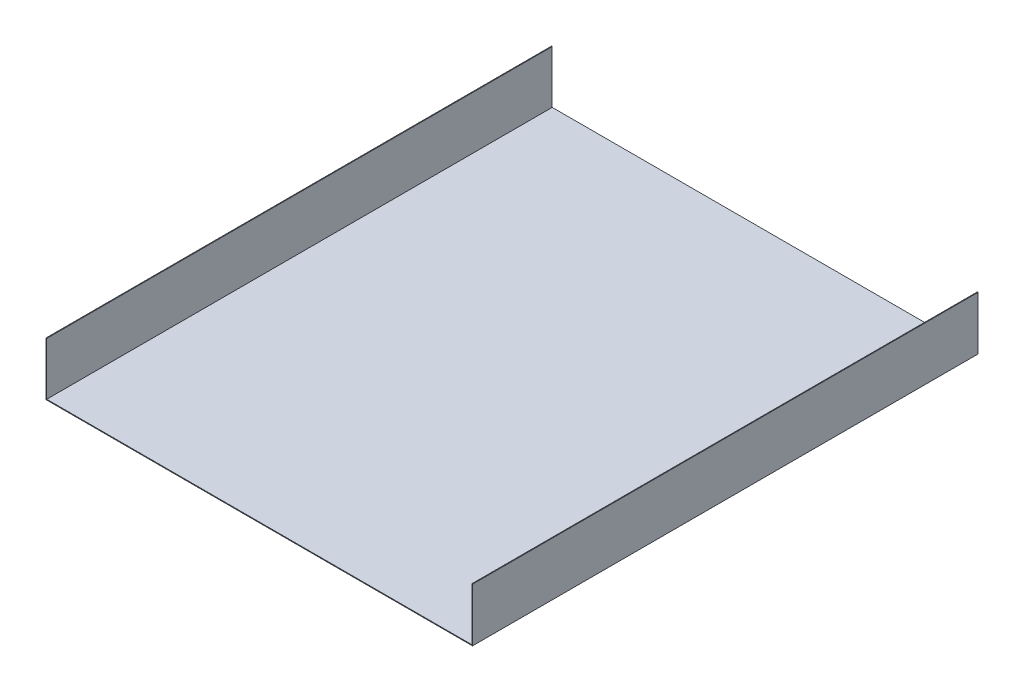
ISO-10303-21;
HEADER;
FILE_DESCRIPTION(('STEP AP214'),'2;1');
FILE_NAME('part.step','',(''),(''),'','','');
FILE_SCHEMA(('AUTOMOTIVE_DESIGN { 1 0 10303 214 1 1 1 1 }'));
ENDSEC;
DATA;
#1=APPLICATION_CONTEXT('core data for automotive mechanical design processes');
#2=APPLICATION_PROTOCOL_DEFINITION('international standard','automotive_design',2000,#1);
#3=PRODUCT_CONTEXT('',#1,'mechanical');
#4=PRODUCT('Part','Part','',(#3));
#5=PRODUCT_RELATED_PRODUCT_CATEGORY('part','',(#4));
#6=PRODUCT_DEFINITION_FORMATION('','',#4);
#7=PRODUCT_DEFINITION_CONTEXT('part definition',#1,'design');
#8=PRODUCT_DEFINITION('design','',#6,#7);
#9=PRODUCT_DEFINITION_SHAPE('','',#8);
#10=(LENGTH_UNIT() NAMED_UNIT(*) SI_UNIT(.MILLI.,.METRE.));
#11=(NAMED_UNIT(*) PLANE_ANGLE_UNIT() SI_UNIT($,.RADIAN.));
#12=(NAMED_UNIT(*) SI_UNIT($,.STERADIAN.) SOLID_ANGLE_UNIT());
#13=UNCERTAINTY_MEASURE_WITH_UNIT(LENGTH_MEASURE(1.E-05),#10,'distance_accuracy_value','');
#14=(GEOMETRIC_REPRESENTATION_CONTEXT(3) GLOBAL_UNCERTAINTY_ASSIGNED_CONTEXT((#13)) GLOBAL_UNIT_ASSIGNED_CONTEXT((#10,
#11,#12)) REPRESENTATION_CONTEXT('',''));
#15=CARTESIAN_POINT('',(0.,0.,0.));
#16=DIRECTION('',(0.,0.,1.));
#17=DIRECTION('',(1.,0.,0.));
#18=AXIS2_PLACEMENT_3D('',#15,#16,#17);
#19=CARTESIAN_POINT('',(14.7,82.,-700.));
#20=DIRECTION('',(0.,1.,0.));
#21=DIRECTION('',(0.,0.,1.));
#22=AXIS2_PLACEMENT_3D('',#19,#20,#21);
#23=PLANE('',#22);
#24=DIRECTION('',(-1.,0.,0.));
#25=VECTOR('',#24,1.);
#26=CARTESIAN_POINT('',(14.7,82.,0.));
#27=LINE('',#26,#25);
#28=CARTESIAN_POINT('',(14.7,82.,0.));
#29=VERTEX_POINT('',#28);
#30=CARTESIAN_POINT('',(13.7,82.,0.));
#31=VERTEX_POINT('',#30);
#32=EDGE_CURVE('E136',#29,#31,#27,.T.);
#33=ORIENTED_EDGE('',*,*,#32,.F.);
#34=DIRECTION('',(0.,0.,1.));
#35=VECTOR('',#34,1.);
#36=CARTESIAN_POINT('',(14.7,82.,-700.));
#37=LINE('',#36,#35);
#38=CARTESIAN_POINT('',(14.7,82.,-700.));
#39=VERTEX_POINT('',#38);
#40=EDGE_CURVE('E11',#39,#29,#37,.T.);
#41=ORIENTED_EDGE('',*,*,#40,.F.);
#42=DIRECTION('',(-1.,0.,0.));
#43=VECTOR('',#42,1.);
#44=CARTESIAN_POINT('',(14.7,82.,-700.));
#45=LINE('',#44,#43);
#46=CARTESIAN_POINT('',(13.7,82.,-700.));
#47=VERTEX_POINT('',#46);
#48=EDGE_CURVE('E156',#39,#47,#45,.T.);
#49=ORIENTED_EDGE('',*,*,#48,.T.);
#50=DIRECTION('',(0.,0.,1.));
#51=VECTOR('',#50,1.);
#52=CARTESIAN_POINT('',(13.7,82.,-700.));
#53=LINE('',#52,#51);
#54=EDGE_CURVE('E42',#47,#31,#53,.T.);
#55=ORIENTED_EDGE('',*,*,#54,.T.);
#56=EDGE_LOOP('',(#33,#41,#49,#55));
#57=FACE_BOUND('',#56,.T.);
#58=ADVANCED_FACE('F39',(#57),#23,.T.);
#59=CARTESIAN_POINT('',(14.7,9.,-700.));
#60=DIRECTION('',(1.,0.,0.));
#61=DIRECTION('',(0.,0.,-1.));
#62=AXIS2_PLACEMENT_3D('',#59,#60,#61);
#63=PLANE('',#62);
#64=DIRECTION('',(0.,1.,0.));
#65=VECTOR('',#64,1.);
#66=CARTESIAN_POINT('',(14.7,9.,0.));
#67=LINE('',#66,#65);
#68=CARTESIAN_POINT('',(14.7,9.,0.));
#69=VERTEX_POINT('',#68);
#70=EDGE_CURVE('E154',#69,#29,#67,.T.);
#71=ORIENTED_EDGE('',*,*,#70,.F.);
#72=DIRECTION('',(0.,0.,1.));
#73=VECTOR('',#72,1.);
#74=CARTESIAN_POINT('',(14.7,9.,-700.));
#75=LINE('',#74,#73);
#76=CARTESIAN_POINT('',(14.7,9.,-700.));
#77=VERTEX_POINT('',#76);
#78=EDGE_CURVE('E48',#77,#69,#75,.T.);
#79=ORIENTED_EDGE('',*,*,#78,.F.);
#80=DIRECTION('',(0.,1.,0.));
#81=VECTOR('',#80,1.);
#82=CARTESIAN_POINT('',(14.7,9.,-700.));
#83=LINE('',#82,#81);
#84=EDGE_CURVE('E126',#77,#39,#83,.T.);
#85=ORIENTED_EDGE('',*,*,#84,.T.);
#86=ORIENTED_EDGE('',*,*,#40,.T.);
#87=EDGE_LOOP('',(#71,#79,#85,#86));
#88=FACE_BOUND('',#87,.T.);
#89=ADVANCED_FACE('F168',(#88),#63,.T.);
#90=CARTESIAN_POINT('',(603.3,9.,-700.));
#91=DIRECTION('',(0.,1.,0.));
#92=DIRECTION('',(0.,0.,1.));
#93=AXIS2_PLACEMENT_3D('',#90,#91,#92);
#94=PLANE('',#93);
#95=DIRECTION('',(-1.,0.,0.));
#96=VECTOR('',#95,1.);
#97=CARTESIAN_POINT('',(603.3,9.,0.));
#98=LINE('',#97,#96);
#99=CARTESIAN_POINT('',(603.3,9.,0.));
#100=VERTEX_POINT('',#99);
#101=EDGE_CURVE('E113',#100,#69,#98,.T.);
#102=ORIENTED_EDGE('',*,*,#101,.F.);
#103=DIRECTION('',(0.,0.,1.));
#104=VECTOR('',#103,1.);
#105=CARTESIAN_POINT('',(603.3,9.,-700.));
#106=LINE('',#105,#104);
#107=CARTESIAN_POINT('',(603.3,9.,-700.));
#108=VERTEX_POINT('',#107);
#109=EDGE_CURVE('E108',#108,#100,#106,.T.);
#110=ORIENTED_EDGE('',*,*,#109,.F.);
#111=DIRECTION('',(-1.,0.,0.));
#112=VECTOR('',#111,1.);
#113=CARTESIAN_POINT('',(603.3,9.,-700.));
#114=LINE('',#113,#112);
#115=EDGE_CURVE('E111',#108,#77,#114,.T.);
#116=ORIENTED_EDGE('',*,*,#115,.T.);
#117=ORIENTED_EDGE('',*,*,#78,.T.);
#118=EDGE_LOOP('',(#102,#110,#116,#117));
#119=FACE_BOUND('',#118,.T.);
#120=ADVANCED_FACE('F110',(#119),#94,.T.);
#121=CARTESIAN_POINT('',(603.3,82.,-700.));
#122=DIRECTION('',(-1.,0.,0.));
#123=DIRECTION('',(0.,0.,1.));
#124=AXIS2_PLACEMENT_3D('',#121,#122,#123);
#125=PLANE('',#124);
#126=DIRECTION('',(0.,-1.,0.));
#127=VECTOR('',#126,1.);
#128=CARTESIAN_POINT('',(603.3,82.,0.));
#129=LINE('',#128,#127);
#130=CARTESIAN_POINT('',(603.3,82.,0.));
#131=VERTEX_POINT('',#130);
#132=EDGE_CURVE('E151',#131,#100,#129,.T.);
#133=ORIENTED_EDGE('',*,*,#132,.F.);
#134=DIRECTION('',(0.,0.,1.));
#135=VECTOR('',#134,1.);
#136=CARTESIAN_POINT('',(603.3,82.,-700.));
#137=LINE('',#136,#135);
#138=CARTESIAN_POINT('',(603.3,82.,-700.));
#139=VERTEX_POINT('',#138);
#140=EDGE_CURVE('E118',#139,#131,#137,.T.);
#141=ORIENTED_EDGE('',*,*,#140,.F.);
#142=DIRECTION('',(0.,-1.,0.));
#143=VECTOR('',#142,1.);
#144=CARTESIAN_POINT('',(603.3,82.,-700.));
#145=LINE('',#144,#143);
#146=EDGE_CURVE('E124',#139,#108,#145,.T.);
#147=ORIENTED_EDGE('',*,*,#146,.T.);
#148=ORIENTED_EDGE('',*,*,#109,.T.);
#149=EDGE_LOOP('',(#133,#141,#147,#148));
#150=FACE_BOUND('',#149,.T.);
#151=ADVANCED_FACE('F128',(#150),#125,.T.);
#152=CARTESIAN_POINT('',(604.3,82.,-700.));
#153=DIRECTION('',(0.,1.,0.));
#154=DIRECTION('',(0.,0.,1.));
#155=AXIS2_PLACEMENT_3D('',#152,#153,#154);
#156=PLANE('',#155);
#157=DIRECTION('',(-1.,0.,0.));
#158=VECTOR('',#157,1.);
#159=CARTESIAN_POINT('',(604.3,82.,0.));
#160=LINE('',#159,#158);
#161=CARTESIAN_POINT('',(604.3,82.,0.));
#162=VERTEX_POINT('',#161);
#163=EDGE_CURVE('E148',#162,#131,#160,.T.);
#164=ORIENTED_EDGE('',*,*,#163,.F.);
#165=DIRECTION('',(0.,0.,1.));
#166=VECTOR('',#165,1.);
#167=CARTESIAN_POINT('',(604.3,82.,-700.));
#168=LINE('',#167,#166);
#169=CARTESIAN_POINT('',(604.3,82.,-700.));
#170=VERTEX_POINT('',#169);
#171=EDGE_CURVE('E160',#170,#162,#168,.T.);
#172=ORIENTED_EDGE('',*,*,#171,.F.);
#173=DIRECTION('',(-1.,0.,0.));
#174=VECTOR('',#173,1.);
#175=CARTESIAN_POINT('',(604.3,82.,-700.));
#176=LINE('',#175,#174);
#177=EDGE_CURVE('E129',#170,#139,#176,.T.);
#178=ORIENTED_EDGE('',*,*,#177,.T.);
#179=ORIENTED_EDGE('',*,*,#140,.T.);
#180=EDGE_LOOP('',(#164,#172,#178,#179));
#181=FACE_BOUND('',#180,.T.);
#182=ADVANCED_FACE('F181',(#181),#156,.T.);
#183=CARTESIAN_POINT('',(604.3,8.,-700.));
#184=DIRECTION('',(1.,0.,0.));
#185=DIRECTION('',(0.,0.,-1.));
#186=AXIS2_PLACEMENT_3D('',#183,#184,#185);
#187=PLANE('',#186);
#188=DIRECTION('',(0.,1.,0.));
#189=VECTOR('',#188,1.);
#190=CARTESIAN_POINT('',(604.3,8.,0.));
#191=LINE('',#190,#189);
#192=CARTESIAN_POINT('',(604.3,8.,0.));
#193=VERTEX_POINT('',#192);
#194=EDGE_CURVE('E145',#193,#162,#191,.T.);
#195=ORIENTED_EDGE('',*,*,#194,.F.);
#196=DIRECTION('',(0.,0.,1.));
#197=VECTOR('',#196,1.);
#198=CARTESIAN_POINT('',(604.3,8.,-700.));
#199=LINE('',#198,#197);
#200=CARTESIAN_POINT('',(604.3,8.,-700.));
#201=VERTEX_POINT('',#200);
#202=EDGE_CURVE('E162',#201,#193,#199,.T.);
#203=ORIENTED_EDGE('',*,*,#202,.F.);
#204=DIRECTION('',(0.,1.,0.));
#205=VECTOR('',#204,1.);
#206=CARTESIAN_POINT('',(604.3,8.,-700.));
#207=LINE('',#206,#205);
#208=EDGE_CURVE('E131',#201,#170,#207,.T.);
#209=ORIENTED_EDGE('',*,*,#208,.T.);
#210=ORIENTED_EDGE('',*,*,#171,.T.);
#211=EDGE_LOOP('',(#195,#203,#209,#210));
#212=FACE_BOUND('',#211,.T.);
#213=ADVANCED_FACE('F184',(#212),#187,.T.);
#214=CARTESIAN_POINT('',(13.7,8.,-700.));
#215=DIRECTION('',(0.,-1.,0.));
#216=DIRECTION('',(0.,0.,-1.));
#217=AXIS2_PLACEMENT_3D('',#214,#215,#216);
#218=PLANE('',#217);
#219=DIRECTION('',(1.,0.,0.));
#220=VECTOR('',#219,1.);
#221=CARTESIAN_POINT('',(13.7,8.,0.));
#222=LINE('',#221,#220);
#223=CARTESIAN_POINT('',(13.7,8.,0.));
#224=VERTEX_POINT('',#223);
#225=EDGE_CURVE('E142',#224,#193,#222,.T.);
#226=ORIENTED_EDGE('',*,*,#225,.F.);
#227=DIRECTION('',(0.,0.,1.));
#228=VECTOR('',#227,1.);
#229=CARTESIAN_POINT('',(13.7,8.,-700.));
#230=LINE('',#229,#228);
#231=CARTESIAN_POINT('',(13.7,8.,-700.));
#232=VERTEX_POINT('',#231);
#233=EDGE_CURVE('E163',#232,#224,#230,.T.);
#234=ORIENTED_EDGE('',*,*,#233,.F.);
#235=DIRECTION('',(1.,0.,0.));
#236=VECTOR('',#235,1.);
#237=CARTESIAN_POINT('',(13.7,8.,-700.));
#238=LINE('',#237,#236);
#239=EDGE_CURVE('E259',#232,#201,#238,.T.);
#240=ORIENTED_EDGE('',*,*,#239,.T.);
#241=ORIENTED_EDGE('',*,*,#202,.T.);
#242=EDGE_LOOP('',(#226,#234,#240,#241));
#243=FACE_BOUND('',#242,.T.);
#244=ADVANCED_FACE('F188',(#243),#218,.T.);
#245=CARTESIAN_POINT('',(13.7,82.,-700.));
#246=DIRECTION('',(-1.,0.,0.));
#247=DIRECTION('',(0.,0.,1.));
#248=AXIS2_PLACEMENT_3D('',#245,#246,#247);
#249=PLANE('',#248);
#250=DIRECTION('',(0.,-1.,0.));
#251=VECTOR('',#250,1.);
#252=CARTESIAN_POINT('',(13.7,82.,0.));
#253=LINE('',#252,#251);
#254=EDGE_CURVE('E139',#31,#224,#253,.T.);
#255=ORIENTED_EDGE('',*,*,#254,.F.);
#256=ORIENTED_EDGE('',*,*,#54,.F.);
#257=DIRECTION('',(0.,-1.,0.));
#258=VECTOR('',#257,1.);
#259=CARTESIAN_POINT('',(13.7,82.,-700.));
#260=LINE('',#259,#258);
#261=EDGE_CURVE('E260',#47,#232,#260,.T.);
#262=ORIENTED_EDGE('',*,*,#261,.T.);
#263=ORIENTED_EDGE('',*,*,#233,.T.);
#264=EDGE_LOOP('',(#255,#256,#262,#263));
#265=FACE_BOUND('',#264,.T.);
#266=ADVANCED_FACE('F165',(#265),#249,.T.);
#267=CARTESIAN_POINT('',(0.,0.,-700.));
#268=DIRECTION('',(0.,0.,1.));
#269=DIRECTION('',(1.,0.,0.));
#270=AXIS2_PLACEMENT_3D('',#267,#268,#269);
#271=PLANE('',#270);
#272=ORIENTED_EDGE('',*,*,#48,.F.);
#273=ORIENTED_EDGE('',*,*,#84,.F.);
#274=ORIENTED_EDGE('',*,*,#115,.F.);
#275=ORIENTED_EDGE('',*,*,#146,.F.);
#276=ORIENTED_EDGE('',*,*,#177,.F.);
#277=ORIENTED_EDGE('',*,*,#208,.F.);
#278=ORIENTED_EDGE('',*,*,#239,.F.);
#279=ORIENTED_EDGE('',*,*,#261,.F.);
#280=EDGE_LOOP('',(#272,#273,#274,#275,#276,#277,#278,#279));
#281=FACE_BOUND('',#280,.T.);
#282=ADVANCED_FACE('F122',(#281),#271,.F.);
#283=CARTESIAN_POINT('',(0.,0.,0.));
#284=DIRECTION('',(0.,0.,1.));
#285=DIRECTION('',(1.,0.,0.));
#286=AXIS2_PLACEMENT_3D('',#283,#284,#285);
#287=PLANE('',#286);
#288=ORIENTED_EDGE('',*,*,#32,.T.);
#289=ORIENTED_EDGE('',*,*,#254,.T.);
#290=ORIENTED_EDGE('',*,*,#225,.T.);
#291=ORIENTED_EDGE('',*,*,#194,.T.);
#292=ORIENTED_EDGE('',*,*,#163,.T.);
#293=ORIENTED_EDGE('',*,*,#132,.T.);
#294=ORIENTED_EDGE('',*,*,#101,.T.);
#295=ORIENTED_EDGE('',*,*,#70,.T.);
#296=EDGE_LOOP('',(#288,#289,#290,#291,#292,#293,#294,#295));
#297=FACE_BOUND('',#296,.T.);
#298=ADVANCED_FACE('F167',(#297),#287,.T.);
#299=CLOSED_SHELL('',(#58,#89,#120,#151,#182,#213,#244,#266,#282,#298));
#300=MANIFOLD_SOLID_BREP('B2',#299);
#301=ADVANCED_BREP_SHAPE_REPRESENTATION('',(#18,#300),#14);
#302=SHAPE_DEFINITION_REPRESENTATION(#9,#301);
ENDSEC;
END-ISO-10303-21;
